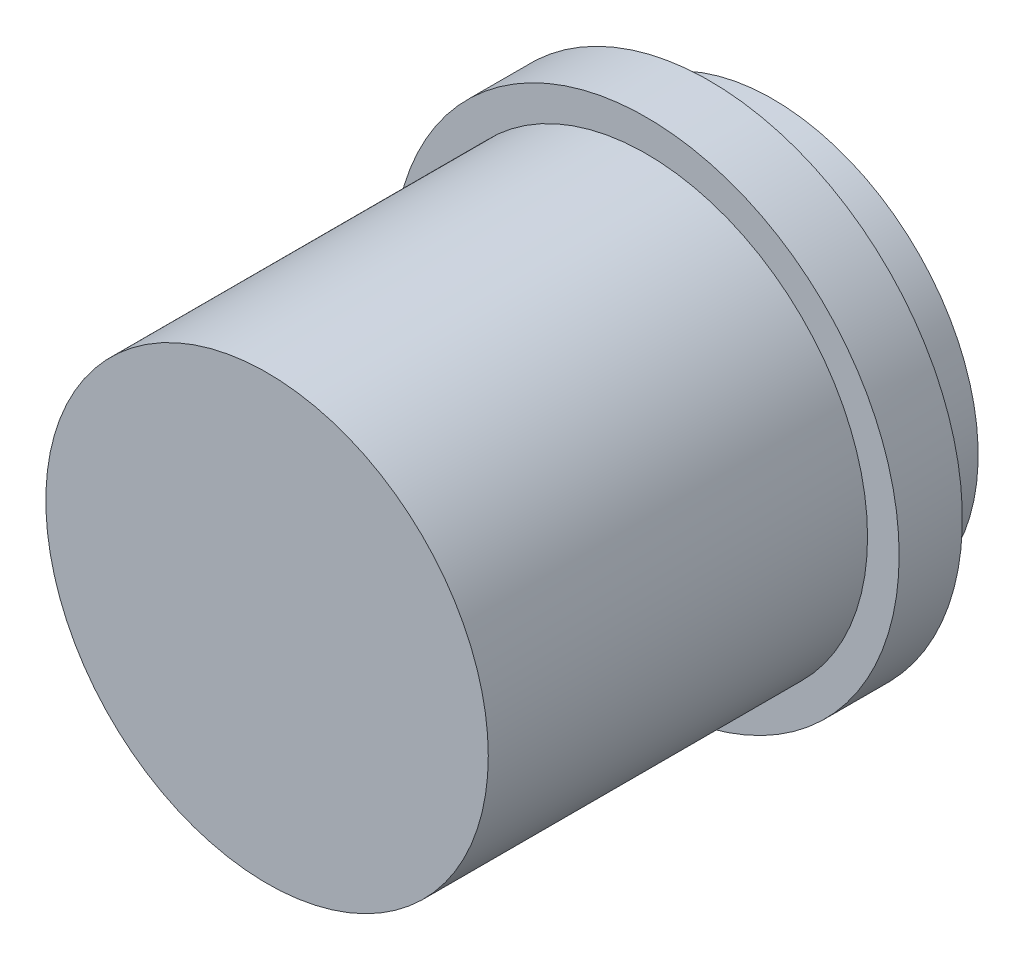
ISO-10303-21;
HEADER;
FILE_DESCRIPTION(('STEP AP214'),'2;1');
FILE_NAME('part.step','',(''),(''),'','','');
FILE_SCHEMA(('AUTOMOTIVE_DESIGN { 1 0 10303 214 1 1 1 1 }'));
ENDSEC;
DATA;
#1=APPLICATION_CONTEXT('core data for automotive mechanical design processes');
#2=APPLICATION_PROTOCOL_DEFINITION('international standard','automotive_design',2000,#1);
#3=PRODUCT_CONTEXT('',#1,'mechanical');
#4=PRODUCT('Part','Part','',(#3));
#5=PRODUCT_RELATED_PRODUCT_CATEGORY('part','',(#4));
#6=PRODUCT_DEFINITION_FORMATION('','',#4);
#7=PRODUCT_DEFINITION_CONTEXT('part definition',#1,'design');
#8=PRODUCT_DEFINITION('design','',#6,#7);
#9=PRODUCT_DEFINITION_SHAPE('','',#8);
#10=(LENGTH_UNIT() NAMED_UNIT(*) SI_UNIT(.MILLI.,.METRE.));
#11=(NAMED_UNIT(*) PLANE_ANGLE_UNIT() SI_UNIT($,.RADIAN.));
#12=(NAMED_UNIT(*) SI_UNIT($,.STERADIAN.) SOLID_ANGLE_UNIT());
#13=UNCERTAINTY_MEASURE_WITH_UNIT(LENGTH_MEASURE(1.E-05),#10,'distance_accuracy_value','');
#14=(GEOMETRIC_REPRESENTATION_CONTEXT(3) GLOBAL_UNCERTAINTY_ASSIGNED_CONTEXT((#13)) GLOBAL_UNIT_ASSIGNED_CONTEXT((#10,
#11,#12)) REPRESENTATION_CONTEXT('',''));
#15=CARTESIAN_POINT('',(0.,0.,0.));
#16=DIRECTION('',(0.,0.,1.));
#17=DIRECTION('',(1.,0.,0.));
#18=AXIS2_PLACEMENT_3D('',#15,#16,#17);
#19=CARTESIAN_POINT('',(0.,0.,16.));
#20=DIRECTION('',(0.,0.,-1.));
#21=DIRECTION('',(-1.,0.,0.));
#22=AXIS2_PLACEMENT_3D('',#19,#20,#21);
#23=CYLINDRICAL_SURFACE('',#22,8.);
#24=CARTESIAN_POINT('',(0.,0.,4.));
#25=DIRECTION('',(0.,0.,1.));
#26=DIRECTION('',(1.,0.,0.));
#27=AXIS2_PLACEMENT_3D('',#24,#25,#26);
#28=CIRCLE('',#27,8.);
#29=CARTESIAN_POINT('',(8.,0.,4.));
#30=VERTEX_POINT('',#29);
#31=EDGE_CURVE('E10',#30,#30,#28,.T.);
#32=ORIENTED_EDGE('',*,*,#31,.F.);
#33=EDGE_LOOP('',(#32));
#34=FACE_BOUND('',#33,.T.);
#35=CARTESIAN_POINT('',(0.,0.,2.));
#36=DIRECTION('',(0.,0.,-1.));
#37=DIRECTION('',(-1.,0.,0.));
#38=AXIS2_PLACEMENT_3D('',#35,#36,#37);
#39=CIRCLE('',#38,8.);
#40=CARTESIAN_POINT('',(-8.,0.,2.));
#41=VERTEX_POINT('',#40);
#42=EDGE_CURVE('E49',#41,#41,#39,.T.);
#43=ORIENTED_EDGE('',*,*,#42,.F.);
#44=EDGE_LOOP('',(#43));
#45=FACE_BOUND('',#44,.T.);
#46=ADVANCED_FACE('F34',(#34,#45),#23,.T.);
#47=CARTESIAN_POINT('',(0.,0.,4.));
#48=DIRECTION('',(0.,0.,1.));
#49=DIRECTION('',(1.,0.,0.));
#50=AXIS2_PLACEMENT_3D('',#47,#48,#49);
#51=PLANE('',#50);
#52=CARTESIAN_POINT('',(0.,0.,4.));
#53=DIRECTION('',(0.,0.,1.));
#54=DIRECTION('',(1.,0.,0.));
#55=AXIS2_PLACEMENT_3D('',#52,#53,#54);
#56=CIRCLE('',#55,7.);
#57=CARTESIAN_POINT('',(7.,0.,4.));
#58=VERTEX_POINT('',#57);
#59=EDGE_CURVE('E40',#58,#58,#56,.T.);
#60=ORIENTED_EDGE('',*,*,#59,.F.);
#61=EDGE_LOOP('',(#60));
#62=FACE_BOUND('',#61,.T.);
#63=ORIENTED_EDGE('',*,*,#31,.T.);
#64=EDGE_LOOP('',(#63));
#65=FACE_BOUND('',#64,.T.);
#66=ADVANCED_FACE('F71',(#62,#65),#51,.T.);
#67=CARTESIAN_POINT('',(0.,0.,4.));
#68=DIRECTION('',(0.,0.,1.));
#69=DIRECTION('',(1.,0.,0.));
#70=AXIS2_PLACEMENT_3D('',#67,#68,#69);
#71=CYLINDRICAL_SURFACE('',#70,7.);
#72=ORIENTED_EDGE('',*,*,#59,.T.);
#73=EDGE_LOOP('',(#72));
#74=FACE_BOUND('',#73,.T.);
#75=CARTESIAN_POINT('',(0.,0.,16.));
#76=DIRECTION('',(0.,0.,1.));
#77=DIRECTION('',(1.,0.,0.));
#78=AXIS2_PLACEMENT_3D('',#75,#76,#77);
#79=CIRCLE('',#78,7.);
#80=CARTESIAN_POINT('',(7.,0.,16.));
#81=VERTEX_POINT('',#80);
#82=EDGE_CURVE('E44',#81,#81,#79,.T.);
#83=ORIENTED_EDGE('',*,*,#82,.F.);
#84=EDGE_LOOP('',(#83));
#85=FACE_BOUND('',#84,.T.);
#86=ADVANCED_FACE('F76',(#74,#85),#71,.T.);
#87=CARTESIAN_POINT('',(0.,0.,16.));
#88=DIRECTION('',(0.,0.,1.));
#89=DIRECTION('',(1.,0.,0.));
#90=AXIS2_PLACEMENT_3D('',#87,#88,#89);
#91=PLANE('',#90);
#92=ORIENTED_EDGE('',*,*,#82,.T.);
#93=EDGE_LOOP('',(#92));
#94=FACE_BOUND('',#93,.T.);
#95=ADVANCED_FACE('F66',(#94),#91,.T.);
#96=CARTESIAN_POINT('',(0.,0.,2.));
#97=DIRECTION('',(0.,0.,-1.));
#98=DIRECTION('',(-1.,0.,0.));
#99=AXIS2_PLACEMENT_3D('',#96,#97,#98);
#100=PLANE('',#99);
#101=CARTESIAN_POINT('',(0.,0.,2.));
#102=DIRECTION('',(0.,0.,-1.));
#103=DIRECTION('',(-1.,0.,0.));
#104=AXIS2_PLACEMENT_3D('',#101,#102,#103);
#105=CIRCLE('',#104,6.5);
#106=CARTESIAN_POINT('',(-6.5,0.,2.));
#107=VERTEX_POINT('',#106);
#108=EDGE_CURVE('E53',#107,#107,#105,.T.);
#109=ORIENTED_EDGE('',*,*,#108,.F.);
#110=EDGE_LOOP('',(#109));
#111=FACE_BOUND('',#110,.T.);
#112=ORIENTED_EDGE('',*,*,#42,.T.);
#113=EDGE_LOOP('',(#112));
#114=FACE_BOUND('',#113,.T.);
#115=ADVANCED_FACE('F63',(#111,#114),#100,.T.);
#116=CARTESIAN_POINT('',(0.,0.,2.));
#117=DIRECTION('',(0.,0.,-1.));
#118=DIRECTION('',(-1.,0.,0.));
#119=AXIS2_PLACEMENT_3D('',#116,#117,#118);
#120=CYLINDRICAL_SURFACE('',#119,6.5);
#121=ORIENTED_EDGE('',*,*,#108,.T.);
#122=EDGE_LOOP('',(#121));
#123=FACE_BOUND('',#122,.T.);
#124=CARTESIAN_POINT('',(0.,0.,0.));
#125=DIRECTION('',(0.,0.,-1.));
#126=DIRECTION('',(-1.,0.,0.));
#127=AXIS2_PLACEMENT_3D('',#124,#125,#126);
#128=CIRCLE('',#127,6.5);
#129=CARTESIAN_POINT('',(-6.5,0.,0.));
#130=VERTEX_POINT('',#129);
#131=EDGE_CURVE('E54',#130,#130,#128,.T.);
#132=ORIENTED_EDGE('',*,*,#131,.F.);
#133=EDGE_LOOP('',(#132));
#134=FACE_BOUND('',#133,.T.);
#135=ADVANCED_FACE('F60',(#123,#134),#120,.T.);
#136=CARTESIAN_POINT('',(0.,0.,0.));
#137=DIRECTION('',(0.,0.,1.));
#138=DIRECTION('',(1.,0.,0.));
#139=AXIS2_PLACEMENT_3D('',#136,#137,#138);
#140=PLANE('',#139);
#141=ORIENTED_EDGE('',*,*,#131,.T.);
#142=EDGE_LOOP('',(#141));
#143=FACE_BOUND('',#142,.T.);
#144=ADVANCED_FACE('F86',(#143),#140,.F.);
#145=CLOSED_SHELL('',(#46,#66,#86,#95,#115,#135,#144));
#146=MANIFOLD_SOLID_BREP('B2',#145);
#147=ADVANCED_BREP_SHAPE_REPRESENTATION('',(#18,#146),#14);
#148=SHAPE_DEFINITION_REPRESENTATION(#9,#147);
ENDSEC;
END-ISO-10303-21;
